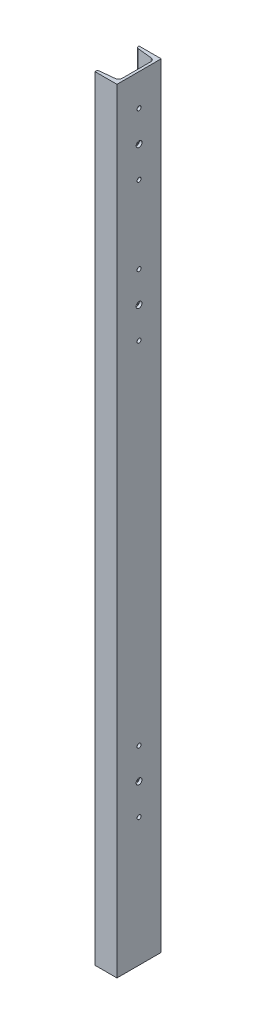
ISO-10303-21;
HEADER;
FILE_DESCRIPTION(('STEP AP214'),'2;1');
FILE_NAME('part.step','',(''),(''),'','','');
FILE_SCHEMA(('AUTOMOTIVE_DESIGN { 1 0 10303 214 1 1 1 1 }'));
ENDSEC;
DATA;
#1=APPLICATION_CONTEXT('core data for automotive mechanical design processes');
#2=APPLICATION_PROTOCOL_DEFINITION('international standard','automotive_design',2000,#1);
#3=PRODUCT_CONTEXT('',#1,'mechanical');
#4=PRODUCT('Part','Part','',(#3));
#5=PRODUCT_RELATED_PRODUCT_CATEGORY('part','',(#4));
#6=PRODUCT_DEFINITION_FORMATION('','',#4);
#7=PRODUCT_DEFINITION_CONTEXT('part definition',#1,'design');
#8=PRODUCT_DEFINITION('design','',#6,#7);
#9=PRODUCT_DEFINITION_SHAPE('','',#8);
#10=(LENGTH_UNIT() NAMED_UNIT(*) SI_UNIT(.MILLI.,.METRE.));
#11=(NAMED_UNIT(*) PLANE_ANGLE_UNIT() SI_UNIT($,.RADIAN.));
#12=(NAMED_UNIT(*) SI_UNIT($,.STERADIAN.) SOLID_ANGLE_UNIT());
#13=UNCERTAINTY_MEASURE_WITH_UNIT(LENGTH_MEASURE(1.E-05),#10,'distance_accuracy_value','');
#14=(GEOMETRIC_REPRESENTATION_CONTEXT(3) GLOBAL_UNCERTAINTY_ASSIGNED_CONTEXT((#13)) GLOBAL_UNIT_ASSIGNED_CONTEXT((#10,
#11,#12)) REPRESENTATION_CONTEXT('',''));
#15=CARTESIAN_POINT('',(0.,0.,0.));
#16=DIRECTION('',(0.,0.,1.));
#17=DIRECTION('',(1.,0.,0.));
#18=AXIS2_PLACEMENT_3D('',#15,#16,#17);
#19=CARTESIAN_POINT('',(-45.5,1750.,98.3701473289391));
#20=DIRECTION('',(0.,-1.,0.));
#21=DIRECTION('',(0.,0.,-1.));
#22=AXIS2_PLACEMENT_3D('',#19,#20,#21);
#23=CYLINDRICAL_SURFACE('',#22,4.50000000000001);
#24=CARTESIAN_POINT('',(-45.5,0.,98.3701473289391));
#25=DIRECTION('',(0.,1.,0.));
#26=DIRECTION('',(0.,0.,1.));
#27=AXIS2_PLACEMENT_3D('',#24,#25,#26);
#28=CIRCLE('',#27,4.50000000000001);
#29=CARTESIAN_POINT('',(-45.9703780847044,0.,93.8947987997819));
#30=VERTEX_POINT('',#29);
#31=CARTESIAN_POINT('',(-50.,0.,98.3701473289391));
#32=VERTEX_POINT('',#31);
#33=EDGE_CURVE('E214',#30,#32,#28,.T.);
#34=ORIENTED_EDGE('',*,*,#33,.T.);
#35=DIRECTION('',(0.,-1.,0.));
#36=VECTOR('',#35,1.);
#37=CARTESIAN_POINT('',(-50.,1750.,98.3701473289391));
#38=LINE('',#37,#36);
#39=CARTESIAN_POINT('',(-50.,1750.,98.3701473289391));
#40=VERTEX_POINT('',#39);
#41=EDGE_CURVE('E13',#40,#32,#38,.T.);
#42=ORIENTED_EDGE('',*,*,#41,.F.);
#43=CARTESIAN_POINT('',(-45.5,1750.,98.3701473289391));
#44=DIRECTION('',(0.,1.,0.));
#45=DIRECTION('',(0.,0.,1.));
#46=AXIS2_PLACEMENT_3D('',#43,#44,#45);
#47=CIRCLE('',#46,4.50000000000001);
#48=CARTESIAN_POINT('',(-45.9703780847044,1750.,93.8947987997819));
#49=VERTEX_POINT('',#48);
#50=EDGE_CURVE('E248',#49,#40,#47,.T.);
#51=ORIENTED_EDGE('',*,*,#50,.F.);
#52=DIRECTION('',(0.,-1.,0.));
#53=VECTOR('',#52,1.);
#54=CARTESIAN_POINT('',(-45.9703780847044,1750.,93.8947987997819));
#55=LINE('',#54,#53);
#56=EDGE_CURVE('E210',#49,#30,#55,.T.);
#57=ORIENTED_EDGE('',*,*,#56,.T.);
#58=EDGE_LOOP('',(#34,#42,#51,#57));
#59=FACE_BOUND('',#58,.T.);
#60=ADVANCED_FACE('F84',(#59),#23,.T.);
#61=CARTESIAN_POINT('',(-50.,1750.,100.));
#62=DIRECTION('',(1.,0.,0.));
#63=DIRECTION('',(0.,0.,-1.));
#64=AXIS2_PLACEMENT_3D('',#61,#62,#63);
#65=PLANE('',#64);
#66=DIRECTION('',(0.,0.,1.));
#67=VECTOR('',#66,1.);
#68=CARTESIAN_POINT('',(-50.,0.,100.));
#69=LINE('',#68,#67);
#70=CARTESIAN_POINT('',(-50.,0.,100.));
#71=VERTEX_POINT('',#70);
#72=EDGE_CURVE('E218',#32,#71,#69,.T.);
#73=ORIENTED_EDGE('',*,*,#72,.T.);
#74=DIRECTION('',(0.,-1.,0.));
#75=VECTOR('',#74,1.);
#76=CARTESIAN_POINT('',(-50.,1750.,100.));
#77=LINE('',#76,#75);
#78=CARTESIAN_POINT('',(-50.,1750.,100.));
#79=VERTEX_POINT('',#78);
#80=EDGE_CURVE('E94',#79,#71,#77,.T.);
#81=ORIENTED_EDGE('',*,*,#80,.F.);
#82=DIRECTION('',(0.,0.,1.));
#83=VECTOR('',#82,1.);
#84=CARTESIAN_POINT('',(-50.,1750.,100.));
#85=LINE('',#84,#83);
#86=EDGE_CURVE('E158',#40,#79,#85,.T.);
#87=ORIENTED_EDGE('',*,*,#86,.F.);
#88=ORIENTED_EDGE('',*,*,#41,.T.);
#89=EDGE_LOOP('',(#73,#81,#87,#88));
#90=FACE_BOUND('',#89,.T.);
#91=ADVANCED_FACE('F482',(#90),#65,.F.);
#92=CARTESIAN_POINT('',(-50.,1750.,100.));
#93=DIRECTION('',(0.,0.,-1.));
#94=DIRECTION('',(-1.,0.,0.));
#95=AXIS2_PLACEMENT_3D('',#92,#93,#94);
#96=PLANE('',#95);
#97=DIRECTION('',(1.,0.,0.));
#98=VECTOR('',#97,1.);
#99=CARTESIAN_POINT('',(-50.,0.,100.));
#100=LINE('',#99,#98);
#101=CARTESIAN_POINT('',(0.,0.,100.));
#102=VERTEX_POINT('',#101);
#103=EDGE_CURVE('E222',#71,#102,#100,.T.);
#104=ORIENTED_EDGE('',*,*,#103,.T.);
#105=DIRECTION('',(0.,-1.,0.));
#106=VECTOR('',#105,1.);
#107=CARTESIAN_POINT('',(0.,1750.,100.));
#108=LINE('',#107,#106);
#109=CARTESIAN_POINT('',(0.,1750.,100.));
#110=VERTEX_POINT('',#109);
#111=EDGE_CURVE('E275',#110,#102,#108,.T.);
#112=ORIENTED_EDGE('',*,*,#111,.F.);
#113=DIRECTION('',(1.,0.,0.));
#114=VECTOR('',#113,1.);
#115=CARTESIAN_POINT('',(-50.,1750.,100.));
#116=LINE('',#115,#114);
#117=EDGE_CURVE('E357',#79,#110,#116,.T.);
#118=ORIENTED_EDGE('',*,*,#117,.F.);
#119=ORIENTED_EDGE('',*,*,#80,.T.);
#120=EDGE_LOOP('',(#104,#112,#118,#119));
#121=FACE_BOUND('',#120,.T.);
#122=ADVANCED_FACE('F437',(#121),#96,.F.);
#123=CARTESIAN_POINT('',(0.,1750.,100.));
#124=DIRECTION('',(-1.,0.,0.));
#125=DIRECTION('',(0.,0.,1.));
#126=AXIS2_PLACEMENT_3D('',#123,#124,#125);
#127=PLANE('',#126);
#128=CARTESIAN_POINT('',(0.,1538.,50.));
#129=DIRECTION('',(1.,0.,0.));
#130=DIRECTION('',(0.,0.,-1.));
#131=AXIS2_PLACEMENT_3D('',#128,#129,#130);
#132=CIRCLE('',#131,4.59999999999994);
#133=CARTESIAN_POINT('',(0.,1538.,45.4000000000001));
#134=VERTEX_POINT('',#133);
#135=EDGE_CURVE('E326',#134,#134,#132,.T.);
#136=ORIENTED_EDGE('',*,*,#135,.F.);
#137=EDGE_LOOP('',(#136));
#138=FACE_BOUND('',#137,.T.);
#139=CARTESIAN_POINT('',(0.,1678.,50.));
#140=DIRECTION('',(1.,0.,0.));
#141=DIRECTION('',(0.,0.,-1.));
#142=AXIS2_PLACEMENT_3D('',#139,#140,#141);
#143=CIRCLE('',#142,4.59999999999994);
#144=CARTESIAN_POINT('',(0.,1678.,45.4000000000001));
#145=VERTEX_POINT('',#144);
#146=EDGE_CURVE('E311',#145,#145,#143,.T.);
#147=ORIENTED_EDGE('',*,*,#146,.F.);
#148=EDGE_LOOP('',(#147));
#149=FACE_BOUND('',#148,.T.);
#150=CARTESIAN_POINT('',(0.,1363.,50.));
#151=DIRECTION('',(1.,0.,0.));
#152=DIRECTION('',(0.,0.,-1.));
#153=AXIS2_PLACEMENT_3D('',#150,#151,#152);
#154=CIRCLE('',#153,4.59999999999994);
#155=CARTESIAN_POINT('',(0.,1363.,45.4000000000001));
#156=VERTEX_POINT('',#155);
#157=EDGE_CURVE('E307',#156,#156,#154,.T.);
#158=ORIENTED_EDGE('',*,*,#157,.F.);
#159=EDGE_LOOP('',(#158));
#160=FACE_BOUND('',#159,.T.);
#161=CARTESIAN_POINT('',(0.,1223.,50.));
#162=DIRECTION('',(1.,0.,0.));
#163=DIRECTION('',(0.,0.,-1.));
#164=AXIS2_PLACEMENT_3D('',#161,#162,#163);
#165=CIRCLE('',#164,4.59999999999994);
#166=CARTESIAN_POINT('',(0.,1223.,45.4000000000001));
#167=VERTEX_POINT('',#166);
#168=EDGE_CURVE('E303',#167,#167,#165,.T.);
#169=ORIENTED_EDGE('',*,*,#168,.F.);
#170=EDGE_LOOP('',(#169));
#171=FACE_BOUND('',#170,.T.);
#172=CARTESIAN_POINT('',(0.,430.,50.));
#173=DIRECTION('',(1.,0.,0.));
#174=DIRECTION('',(0.,0.,-1.));
#175=AXIS2_PLACEMENT_3D('',#172,#173,#174);
#176=CIRCLE('',#175,4.59999999999999);
#177=CARTESIAN_POINT('',(0.,430.,45.4));
#178=VERTEX_POINT('',#177);
#179=EDGE_CURVE('E298',#178,#178,#176,.T.);
#180=ORIENTED_EDGE('',*,*,#179,.F.);
#181=EDGE_LOOP('',(#180));
#182=FACE_BOUND('',#181,.T.);
#183=CARTESIAN_POINT('',(0.,290.,50.));
#184=DIRECTION('',(1.,0.,0.));
#185=DIRECTION('',(0.,0.,-1.));
#186=AXIS2_PLACEMENT_3D('',#183,#184,#185);
#187=CIRCLE('',#186,4.59999999999999);
#188=CARTESIAN_POINT('',(0.,290.,45.4));
#189=VERTEX_POINT('',#188);
#190=EDGE_CURVE('E297',#189,#189,#187,.T.);
#191=ORIENTED_EDGE('',*,*,#190,.F.);
#192=EDGE_LOOP('',(#191));
#193=FACE_BOUND('',#192,.T.);
#194=CARTESIAN_POINT('',(0.,1608.,50.));
#195=DIRECTION('',(1.,0.,0.));
#196=DIRECTION('',(0.,0.,-1.));
#197=AXIS2_PLACEMENT_3D('',#194,#195,#196);
#198=CIRCLE('',#197,6.59999999999994);
#199=CARTESIAN_POINT('',(0.,1608.,43.4000000000001));
#200=VERTEX_POINT('',#199);
#201=EDGE_CURVE('E292',#200,#200,#198,.T.);
#202=ORIENTED_EDGE('',*,*,#201,.F.);
#203=EDGE_LOOP('',(#202));
#204=FACE_BOUND('',#203,.T.);
#205=CARTESIAN_POINT('',(0.,1293.,50.));
#206=DIRECTION('',(1.,0.,0.));
#207=DIRECTION('',(0.,0.,-1.));
#208=AXIS2_PLACEMENT_3D('',#205,#206,#207);
#209=CIRCLE('',#208,6.59999999999994);
#210=CARTESIAN_POINT('',(0.,1293.,43.4000000000001));
#211=VERTEX_POINT('',#210);
#212=EDGE_CURVE('E287',#211,#211,#209,.T.);
#213=ORIENTED_EDGE('',*,*,#212,.F.);
#214=EDGE_LOOP('',(#213));
#215=FACE_BOUND('',#214,.T.);
#216=CARTESIAN_POINT('',(0.,360.,50.));
#217=DIRECTION('',(1.,0.,0.));
#218=DIRECTION('',(0.,0.,-1.));
#219=AXIS2_PLACEMENT_3D('',#216,#217,#218);
#220=CIRCLE('',#219,6.59999999999999);
#221=CARTESIAN_POINT('',(0.,360.,43.4));
#222=VERTEX_POINT('',#221);
#223=EDGE_CURVE('E286',#222,#222,#220,.T.);
#224=ORIENTED_EDGE('',*,*,#223,.F.);
#225=EDGE_LOOP('',(#224));
#226=FACE_BOUND('',#225,.T.);
#227=DIRECTION('',(0.,0.,-1.));
#228=VECTOR('',#227,1.);
#229=CARTESIAN_POINT('',(0.,0.,100.));
#230=LINE('',#229,#228);
#231=CARTESIAN_POINT('',(0.,0.,0.));
#232=VERTEX_POINT('',#231);
#233=EDGE_CURVE('E224',#102,#232,#230,.T.);
#234=ORIENTED_EDGE('',*,*,#233,.T.);
#235=DIRECTION('',(0.,-1.,0.));
#236=VECTOR('',#235,1.);
#237=CARTESIAN_POINT('',(0.,1750.,0.));
#238=LINE('',#237,#236);
#239=CARTESIAN_POINT('',(0.,1750.,0.));
#240=VERTEX_POINT('',#239);
#241=EDGE_CURVE('E271',#240,#232,#238,.T.);
#242=ORIENTED_EDGE('',*,*,#241,.F.);
#243=DIRECTION('',(0.,0.,-1.));
#244=VECTOR('',#243,1.);
#245=CARTESIAN_POINT('',(0.,1750.,100.));
#246=LINE('',#245,#244);
#247=EDGE_CURVE('E360',#110,#240,#246,.T.);
#248=ORIENTED_EDGE('',*,*,#247,.F.);
#249=ORIENTED_EDGE('',*,*,#111,.T.);
#250=EDGE_LOOP('',(#234,#242,#248,#249));
#251=FACE_BOUND('',#250,.T.);
#252=ADVANCED_FACE('F433',(#138,#149,#160,#171,#182,#193,#204,#215,#226,#251),#127,.F.);
#253=CARTESIAN_POINT('',(-50.,1750.,0.));
#254=DIRECTION('',(0.,0.,1.));
#255=DIRECTION('',(1.,0.,0.));
#256=AXIS2_PLACEMENT_3D('',#253,#254,#255);
#257=PLANE('',#256);
#258=DIRECTION('',(-1.,0.,0.));
#259=VECTOR('',#258,1.);
#260=CARTESIAN_POINT('',(-50.,0.,0.));
#261=LINE('',#260,#259);
#262=CARTESIAN_POINT('',(-50.,0.,0.));
#263=VERTEX_POINT('',#262);
#264=EDGE_CURVE('E227',#232,#263,#261,.T.);
#265=ORIENTED_EDGE('',*,*,#264,.T.);
#266=DIRECTION('',(0.,-1.,0.));
#267=VECTOR('',#266,1.);
#268=CARTESIAN_POINT('',(-50.,1750.,0.));
#269=LINE('',#268,#267);
#270=CARTESIAN_POINT('',(-50.,1750.,0.));
#271=VERTEX_POINT('',#270);
#272=EDGE_CURVE('E267',#271,#263,#269,.T.);
#273=ORIENTED_EDGE('',*,*,#272,.F.);
#274=DIRECTION('',(-1.,0.,0.));
#275=VECTOR('',#274,1.);
#276=CARTESIAN_POINT('',(-50.,1750.,0.));
#277=LINE('',#276,#275);
#278=EDGE_CURVE('E363',#240,#271,#277,.T.);
#279=ORIENTED_EDGE('',*,*,#278,.F.);
#280=ORIENTED_EDGE('',*,*,#241,.T.);
#281=EDGE_LOOP('',(#265,#273,#279,#280));
#282=FACE_BOUND('',#281,.T.);
#283=ADVANCED_FACE('F436',(#282),#257,.F.);
#284=CARTESIAN_POINT('',(-50.,1750.,0.));
#285=DIRECTION('',(1.,0.,0.));
#286=DIRECTION('',(0.,0.,-1.));
#287=AXIS2_PLACEMENT_3D('',#284,#285,#286);
#288=PLANE('',#287);
#289=DIRECTION('',(0.,0.,1.));
#290=VECTOR('',#289,1.);
#291=CARTESIAN_POINT('',(-50.,0.,0.));
#292=LINE('',#291,#290);
#293=CARTESIAN_POINT('',(-50.,0.,1.6298526710609));
#294=VERTEX_POINT('',#293);
#295=EDGE_CURVE('E230',#263,#294,#292,.T.);
#296=ORIENTED_EDGE('',*,*,#295,.T.);
#297=DIRECTION('',(0.,-1.,0.));
#298=VECTOR('',#297,1.);
#299=CARTESIAN_POINT('',(-50.,1750.,1.6298526710609));
#300=LINE('',#299,#298);
#301=CARTESIAN_POINT('',(-50.,1750.,1.6298526710609));
#302=VERTEX_POINT('',#301);
#303=EDGE_CURVE('E263',#302,#294,#300,.T.);
#304=ORIENTED_EDGE('',*,*,#303,.F.);
#305=DIRECTION('',(0.,0.,1.));
#306=VECTOR('',#305,1.);
#307=CARTESIAN_POINT('',(-50.,1750.,0.));
#308=LINE('',#307,#306);
#309=EDGE_CURVE('E366',#271,#302,#308,.T.);
#310=ORIENTED_EDGE('',*,*,#309,.F.);
#311=ORIENTED_EDGE('',*,*,#272,.T.);
#312=EDGE_LOOP('',(#296,#304,#310,#311));
#313=FACE_BOUND('',#312,.T.);
#314=ADVANCED_FACE('F471',(#313),#288,.F.);
#315=CARTESIAN_POINT('',(-45.5,1750.,1.6298526710609));
#316=DIRECTION('',(0.,-1.,0.));
#317=DIRECTION('',(0.,0.,-1.));
#318=AXIS2_PLACEMENT_3D('',#315,#316,#317);
#319=CYLINDRICAL_SURFACE('',#318,4.5);
#320=CARTESIAN_POINT('',(-45.5,0.,1.6298526710609));
#321=DIRECTION('',(0.,1.,0.));
#322=DIRECTION('',(0.,0.,-1.));
#323=AXIS2_PLACEMENT_3D('',#320,#321,#322);
#324=CIRCLE('',#323,4.5);
#325=CARTESIAN_POINT('',(-45.9703780847044,0.,6.10520120021813));
#326=VERTEX_POINT('',#325);
#327=EDGE_CURVE('E233',#294,#326,#324,.T.);
#328=ORIENTED_EDGE('',*,*,#327,.T.);
#329=DIRECTION('',(0.,-1.,0.));
#330=VECTOR('',#329,1.);
#331=CARTESIAN_POINT('',(-45.9703780847044,1750.,6.10520120021813));
#332=LINE('',#331,#330);
#333=CARTESIAN_POINT('',(-45.9703780847044,1750.,6.10520120021813));
#334=VERTEX_POINT('',#333);
#335=EDGE_CURVE('E259',#334,#326,#332,.T.);
#336=ORIENTED_EDGE('',*,*,#335,.F.);
#337=CARTESIAN_POINT('',(-45.5,1750.,1.6298526710609));
#338=DIRECTION('',(0.,1.,0.));
#339=DIRECTION('',(0.,0.,-1.));
#340=AXIS2_PLACEMENT_3D('',#337,#338,#339);
#341=CIRCLE('',#340,4.5);
#342=EDGE_CURVE('E369',#302,#334,#341,.T.);
#343=ORIENTED_EDGE('',*,*,#342,.F.);
#344=ORIENTED_EDGE('',*,*,#303,.T.);
#345=EDGE_LOOP('',(#328,#336,#343,#344));
#346=FACE_BOUND('',#345,.T.);
#347=ADVANCED_FACE('F475',(#346),#319,.T.);
#348=CARTESIAN_POINT('',(-13.0637722938588,1750.,9.56382483705384));
#349=DIRECTION('',(0.104528463267648,0.,-0.994521895368274));
#350=DIRECTION('',(-0.994521895368274,0.,-0.104528463267648));
#351=AXIS2_PLACEMENT_3D('',#348,#349,#350);
#352=PLANE('',#351);
#353=DIRECTION('',(0.994521895368274,0.,0.104528463267648));
#354=VECTOR('',#353,1.);
#355=CARTESIAN_POINT('',(-13.0637722938588,0.,9.56382483705384));
#356=LINE('',#355,#354);
#357=CARTESIAN_POINT('',(-13.0637722938588,0.,9.56382483705384));
#358=VERTEX_POINT('',#357);
#359=EDGE_CURVE('E236',#326,#358,#356,.T.);
#360=ORIENTED_EDGE('',*,*,#359,.T.);
#361=DIRECTION('',(0.,-1.,0.));
#362=VECTOR('',#361,1.);
#363=CARTESIAN_POINT('',(-13.0637722938588,1750.,9.56382483705384));
#364=LINE('',#363,#362);
#365=CARTESIAN_POINT('',(-13.0637722938588,1750.,9.56382483705384));
#366=VERTEX_POINT('',#365);
#367=EDGE_CURVE('E255',#366,#358,#364,.T.);
#368=ORIENTED_EDGE('',*,*,#367,.F.);
#369=DIRECTION('',(0.994521895368274,0.,0.104528463267648));
#370=VECTOR('',#369,1.);
#371=CARTESIAN_POINT('',(-13.0637722938588,1750.,9.56382483705384));
#372=LINE('',#371,#370);
#373=EDGE_CURVE('E372',#334,#366,#372,.T.);
#374=ORIENTED_EDGE('',*,*,#373,.F.);
#375=ORIENTED_EDGE('',*,*,#335,.T.);
#376=EDGE_LOOP('',(#360,#368,#374,#375));
#377=FACE_BOUND('',#376,.T.);
#378=ADVANCED_FACE('F490',(#377),#352,.F.);
#379=CARTESIAN_POINT('',(-13.9,1750.,17.52));
#380=DIRECTION('',(0.,-1.,0.));
#381=DIRECTION('',(0.,0.,-1.));
#382=AXIS2_PLACEMENT_3D('',#379,#380,#381);
#383=CYLINDRICAL_SURFACE('',#382,8.);
#384=CARTESIAN_POINT('',(-13.9,0.,17.52));
#385=DIRECTION('',(0.,-1.,0.));
#386=DIRECTION('',(0.,0.,1.));
#387=AXIS2_PLACEMENT_3D('',#384,#385,#386);
#388=CIRCLE('',#387,8.);
#389=CARTESIAN_POINT('',(-5.90000000000001,0.,17.52));
#390=VERTEX_POINT('',#389);
#391=EDGE_CURVE('E239',#358,#390,#388,.T.);
#392=ORIENTED_EDGE('',*,*,#391,.T.);
#393=DIRECTION('',(0.,-1.,0.));
#394=VECTOR('',#393,1.);
#395=CARTESIAN_POINT('',(-5.90000000000001,1750.,17.52));
#396=LINE('',#395,#394);
#397=CARTESIAN_POINT('',(-5.90000000000001,1750.,17.52));
#398=VERTEX_POINT('',#397);
#399=EDGE_CURVE('E200',#398,#390,#396,.T.);
#400=ORIENTED_EDGE('',*,*,#399,.F.);
#401=CARTESIAN_POINT('',(-13.9,1750.,17.52));
#402=DIRECTION('',(0.,-1.,0.));
#403=DIRECTION('',(0.,0.,1.));
#404=AXIS2_PLACEMENT_3D('',#401,#402,#403);
#405=CIRCLE('',#404,8.);
#406=EDGE_CURVE('E189',#366,#398,#405,.T.);
#407=ORIENTED_EDGE('',*,*,#406,.F.);
#408=ORIENTED_EDGE('',*,*,#367,.T.);
#409=EDGE_LOOP('',(#392,#400,#407,#408));
#410=FACE_BOUND('',#409,.T.);
#411=ADVANCED_FACE('F488',(#410),#383,.F.);
#412=CARTESIAN_POINT('',(-5.9,1750.,82.48));
#413=DIRECTION('',(1.,0.,0.));
#414=DIRECTION('',(0.,0.,-1.));
#415=AXIS2_PLACEMENT_3D('',#412,#413,#414);
#416=PLANE('',#415);
#417=CARTESIAN_POINT('',(-5.9,1538.,50.));
#418=DIRECTION('',(1.,0.,0.));
#419=DIRECTION('',(0.,0.,-1.));
#420=AXIS2_PLACEMENT_3D('',#417,#418,#419);
#421=CIRCLE('',#420,4.59999999999994);
#422=CARTESIAN_POINT('',(-5.9,1538.,45.4000000000001));
#423=VERTEX_POINT('',#422);
#424=EDGE_CURVE('E87',#423,#423,#421,.T.);
#425=ORIENTED_EDGE('',*,*,#424,.T.);
#426=EDGE_LOOP('',(#425));
#427=FACE_BOUND('',#426,.T.);
#428=CARTESIAN_POINT('',(-5.9,1678.,50.));
#429=DIRECTION('',(1.,0.,0.));
#430=DIRECTION('',(0.,0.,-1.));
#431=AXIS2_PLACEMENT_3D('',#428,#429,#430);
#432=CIRCLE('',#431,4.59999999999994);
#433=CARTESIAN_POINT('',(-5.9,1678.,45.4000000000001));
#434=VERTEX_POINT('',#433);
#435=EDGE_CURVE('E308',#434,#434,#432,.T.);
#436=ORIENTED_EDGE('',*,*,#435,.T.);
#437=EDGE_LOOP('',(#436));
#438=FACE_BOUND('',#437,.T.);
#439=CARTESIAN_POINT('',(-5.9,1363.,50.));
#440=DIRECTION('',(1.,0.,0.));
#441=DIRECTION('',(0.,0.,-1.));
#442=AXIS2_PLACEMENT_3D('',#439,#440,#441);
#443=CIRCLE('',#442,4.59999999999994);
#444=CARTESIAN_POINT('',(-5.9,1363.,45.4000000000001));
#445=VERTEX_POINT('',#444);
#446=EDGE_CURVE('E304',#445,#445,#443,.T.);
#447=ORIENTED_EDGE('',*,*,#446,.T.);
#448=EDGE_LOOP('',(#447));
#449=FACE_BOUND('',#448,.T.);
#450=CARTESIAN_POINT('',(-5.9,1223.,50.));
#451=DIRECTION('',(1.,0.,0.));
#452=DIRECTION('',(0.,0.,-1.));
#453=AXIS2_PLACEMENT_3D('',#450,#451,#452);
#454=CIRCLE('',#453,4.59999999999994);
#455=CARTESIAN_POINT('',(-5.9,1223.,45.4000000000001));
#456=VERTEX_POINT('',#455);
#457=EDGE_CURVE('E299',#456,#456,#454,.T.);
#458=ORIENTED_EDGE('',*,*,#457,.T.);
#459=EDGE_LOOP('',(#458));
#460=FACE_BOUND('',#459,.T.);
#461=CARTESIAN_POINT('',(-5.9,430.,50.));
#462=DIRECTION('',(1.,0.,0.));
#463=DIRECTION('',(0.,0.,-1.));
#464=AXIS2_PLACEMENT_3D('',#461,#462,#463);
#465=CIRCLE('',#464,4.59999999999999);
#466=CARTESIAN_POINT('',(-5.9,430.,45.4));
#467=VERTEX_POINT('',#466);
#468=EDGE_CURVE('E293',#467,#467,#465,.T.);
#469=ORIENTED_EDGE('',*,*,#468,.T.);
#470=EDGE_LOOP('',(#469));
#471=FACE_BOUND('',#470,.T.);
#472=CARTESIAN_POINT('',(-5.9,290.,50.));
#473=DIRECTION('',(1.,0.,0.));
#474=DIRECTION('',(0.,0.,-1.));
#475=AXIS2_PLACEMENT_3D('',#472,#473,#474);
#476=CIRCLE('',#475,4.59999999999999);
#477=CARTESIAN_POINT('',(-5.9,290.,45.4));
#478=VERTEX_POINT('',#477);
#479=EDGE_CURVE('E338',#478,#478,#476,.T.);
#480=ORIENTED_EDGE('',*,*,#479,.T.);
#481=EDGE_LOOP('',(#480));
#482=FACE_BOUND('',#481,.T.);
#483=CARTESIAN_POINT('',(-5.9,1608.,50.));
#484=DIRECTION('',(1.,0.,0.));
#485=DIRECTION('',(0.,0.,-1.));
#486=AXIS2_PLACEMENT_3D('',#483,#484,#485);
#487=CIRCLE('',#486,6.59999999999994);
#488=CARTESIAN_POINT('',(-5.9,1608.,43.4000000000001));
#489=VERTEX_POINT('',#488);
#490=EDGE_CURVE('E288',#489,#489,#487,.T.);
#491=ORIENTED_EDGE('',*,*,#490,.T.);
#492=EDGE_LOOP('',(#491));
#493=FACE_BOUND('',#492,.T.);
#494=CARTESIAN_POINT('',(-5.9,1293.,50.));
#495=DIRECTION('',(1.,0.,0.));
#496=DIRECTION('',(0.,0.,-1.));
#497=AXIS2_PLACEMENT_3D('',#494,#495,#496);
#498=CIRCLE('',#497,6.59999999999994);
#499=CARTESIAN_POINT('',(-5.9,1293.,43.4000000000001));
#500=VERTEX_POINT('',#499);
#501=EDGE_CURVE('E282',#500,#500,#498,.T.);
#502=ORIENTED_EDGE('',*,*,#501,.T.);
#503=EDGE_LOOP('',(#502));
#504=FACE_BOUND('',#503,.T.);
#505=CARTESIAN_POINT('',(-5.9,360.,50.));
#506=DIRECTION('',(1.,0.,0.));
#507=DIRECTION('',(0.,0.,-1.));
#508=AXIS2_PLACEMENT_3D('',#505,#506,#507);
#509=CIRCLE('',#508,6.59999999999999);
#510=CARTESIAN_POINT('',(-5.9,360.,43.4));
#511=VERTEX_POINT('',#510);
#512=EDGE_CURVE('E219',#511,#511,#509,.T.);
#513=ORIENTED_EDGE('',*,*,#512,.T.);
#514=EDGE_LOOP('',(#513));
#515=FACE_BOUND('',#514,.T.);
#516=DIRECTION('',(0.,0.,1.));
#517=VECTOR('',#516,1.);
#518=CARTESIAN_POINT('',(-5.9,0.,82.48));
#519=LINE('',#518,#517);
#520=CARTESIAN_POINT('',(-5.9,0.,82.48));
#521=VERTEX_POINT('',#520);
#522=EDGE_CURVE('E198',#390,#521,#519,.T.);
#523=ORIENTED_EDGE('',*,*,#522,.T.);
#524=DIRECTION('',(0.,-1.,0.));
#525=VECTOR('',#524,1.);
#526=CARTESIAN_POINT('',(-5.9,1750.,82.48));
#527=LINE('',#526,#525);
#528=CARTESIAN_POINT('',(-5.9,1750.,82.48));
#529=VERTEX_POINT('',#528);
#530=EDGE_CURVE('E195',#529,#521,#527,.T.);
#531=ORIENTED_EDGE('',*,*,#530,.F.);
#532=DIRECTION('',(0.,0.,1.));
#533=VECTOR('',#532,1.);
#534=CARTESIAN_POINT('',(-5.9,1750.,82.48));
#535=LINE('',#534,#533);
#536=EDGE_CURVE('E183',#398,#529,#535,.T.);
#537=ORIENTED_EDGE('',*,*,#536,.F.);
#538=ORIENTED_EDGE('',*,*,#399,.T.);
#539=EDGE_LOOP('',(#523,#531,#537,#538));
#540=FACE_BOUND('',#539,.T.);
#541=ADVANCED_FACE('F196',(#427,#438,#449,#460,#471,#482,#493,#504,#515,#540),#416,.F.);
#542=CARTESIAN_POINT('',(-13.9,1750.,82.48));
#543=DIRECTION('',(0.,-1.,0.));
#544=DIRECTION('',(0.,0.,-1.));
#545=AXIS2_PLACEMENT_3D('',#542,#543,#544);
#546=CYLINDRICAL_SURFACE('',#545,8.);
#547=CARTESIAN_POINT('',(-13.9,0.,82.48));
#548=DIRECTION('',(0.,-1.,0.));
#549=DIRECTION('',(0.,0.,-1.));
#550=AXIS2_PLACEMENT_3D('',#547,#548,#549);
#551=CIRCLE('',#550,8.);
#552=CARTESIAN_POINT('',(-13.0637722938588,0.,90.4361751629462));
#553=VERTEX_POINT('',#552);
#554=EDGE_CURVE('E144',#521,#553,#551,.T.);
#555=ORIENTED_EDGE('',*,*,#554,.T.);
#556=DIRECTION('',(0.,-1.,0.));
#557=VECTOR('',#556,1.);
#558=CARTESIAN_POINT('',(-13.0637722938588,1750.,90.4361751629462));
#559=LINE('',#558,#557);
#560=CARTESIAN_POINT('',(-13.0637722938588,1750.,90.4361751629462));
#561=VERTEX_POINT('',#560);
#562=EDGE_CURVE('E201',#561,#553,#559,.T.);
#563=ORIENTED_EDGE('',*,*,#562,.F.);
#564=CARTESIAN_POINT('',(-13.9,1750.,82.48));
#565=DIRECTION('',(0.,-1.,0.));
#566=DIRECTION('',(0.,0.,-1.));
#567=AXIS2_PLACEMENT_3D('',#564,#565,#566);
#568=CIRCLE('',#567,8.);
#569=EDGE_CURVE('E187',#529,#561,#568,.T.);
#570=ORIENTED_EDGE('',*,*,#569,.F.);
#571=ORIENTED_EDGE('',*,*,#530,.T.);
#572=EDGE_LOOP('',(#555,#563,#570,#571));
#573=FACE_BOUND('',#572,.T.);
#574=ADVANCED_FACE('F203',(#573),#546,.F.);
#575=CARTESIAN_POINT('',(-13.0637722938588,1750.,90.4361751629462));
#576=DIRECTION('',(0.104528463267647,0.,0.994521895368274));
#577=DIRECTION('',(0.994521895368274,0.,-0.104528463267647));
#578=AXIS2_PLACEMENT_3D('',#575,#576,#577);
#579=PLANE('',#578);
#580=DIRECTION('',(-0.994521895368274,0.,0.104528463267647));
#581=VECTOR('',#580,1.);
#582=CARTESIAN_POINT('',(-13.0637722938588,0.,90.4361751629462));
#583=LINE('',#582,#581);
#584=EDGE_CURVE('E150',#553,#30,#583,.T.);
#585=ORIENTED_EDGE('',*,*,#584,.T.);
#586=ORIENTED_EDGE('',*,*,#56,.F.);
#587=DIRECTION('',(-0.994521895368274,0.,0.104528463267647));
#588=VECTOR('',#587,1.);
#589=CARTESIAN_POINT('',(-13.0637722938588,1750.,90.4361751629462));
#590=LINE('',#589,#588);
#591=EDGE_CURVE('E103',#561,#49,#590,.T.);
#592=ORIENTED_EDGE('',*,*,#591,.F.);
#593=ORIENTED_EDGE('',*,*,#562,.T.);
#594=EDGE_LOOP('',(#585,#586,#592,#593));
#595=FACE_BOUND('',#594,.T.);
#596=ADVANCED_FACE('F485',(#595),#579,.F.);
#597=CARTESIAN_POINT('',(-45.5,1750.,98.3701473289391));
#598=DIRECTION('',(0.,1.,0.));
#599=DIRECTION('',(0.,0.,1.));
#600=AXIS2_PLACEMENT_3D('',#597,#598,#599);
#601=PLANE('',#600);
#602=ORIENTED_EDGE('',*,*,#50,.T.);
#603=ORIENTED_EDGE('',*,*,#86,.T.);
#604=ORIENTED_EDGE('',*,*,#117,.T.);
#605=ORIENTED_EDGE('',*,*,#247,.T.);
#606=ORIENTED_EDGE('',*,*,#278,.T.);
#607=ORIENTED_EDGE('',*,*,#309,.T.);
#608=ORIENTED_EDGE('',*,*,#342,.T.);
#609=ORIENTED_EDGE('',*,*,#373,.T.);
#610=ORIENTED_EDGE('',*,*,#406,.T.);
#611=ORIENTED_EDGE('',*,*,#536,.T.);
#612=ORIENTED_EDGE('',*,*,#569,.T.);
#613=ORIENTED_EDGE('',*,*,#591,.T.);
#614=EDGE_LOOP('',(#602,#603,#604,#605,#606,#607,#608,#609,#610,#611,#612,#613));
#615=FACE_BOUND('',#614,.T.);
#616=ADVANCED_FACE('F185',(#615),#601,.T.);
#617=CARTESIAN_POINT('',(-45.5,0.,98.3701473289391));
#618=DIRECTION('',(0.,1.,0.));
#619=DIRECTION('',(0.,0.,1.));
#620=AXIS2_PLACEMENT_3D('',#617,#618,#619);
#621=PLANE('',#620);
#622=ORIENTED_EDGE('',*,*,#33,.F.);
#623=ORIENTED_EDGE('',*,*,#584,.F.);
#624=ORIENTED_EDGE('',*,*,#554,.F.);
#625=ORIENTED_EDGE('',*,*,#522,.F.);
#626=ORIENTED_EDGE('',*,*,#391,.F.);
#627=ORIENTED_EDGE('',*,*,#359,.F.);
#628=ORIENTED_EDGE('',*,*,#327,.F.);
#629=ORIENTED_EDGE('',*,*,#295,.F.);
#630=ORIENTED_EDGE('',*,*,#264,.F.);
#631=ORIENTED_EDGE('',*,*,#233,.F.);
#632=ORIENTED_EDGE('',*,*,#103,.F.);
#633=ORIENTED_EDGE('',*,*,#72,.F.);
#634=EDGE_LOOP('',(#622,#623,#624,#625,#626,#627,#628,#629,#630,#631,#632,#633));
#635=FACE_BOUND('',#634,.T.);
#636=ADVANCED_FACE('F466',(#635),#621,.F.);
#637=CARTESIAN_POINT('',(0.,360.,50.));
#638=DIRECTION('',(1.,0.,0.));
#639=DIRECTION('',(0.,0.,-1.));
#640=AXIS2_PLACEMENT_3D('',#637,#638,#639);
#641=CYLINDRICAL_SURFACE('',#640,6.59999999999999);
#642=ORIENTED_EDGE('',*,*,#223,.T.);
#643=EDGE_LOOP('',(#642));
#644=FACE_BOUND('',#643,.T.);
#645=ORIENTED_EDGE('',*,*,#512,.F.);
#646=EDGE_LOOP('',(#645));
#647=FACE_BOUND('',#646,.T.);
#648=ADVANCED_FACE('F564',(#644,#647),#641,.F.);
#649=CARTESIAN_POINT('',(0.,1293.,50.));
#650=DIRECTION('',(1.,0.,0.));
#651=DIRECTION('',(0.,0.,-1.));
#652=AXIS2_PLACEMENT_3D('',#649,#650,#651);
#653=CYLINDRICAL_SURFACE('',#652,6.59999999999994);
#654=ORIENTED_EDGE('',*,*,#212,.T.);
#655=EDGE_LOOP('',(#654));
#656=FACE_BOUND('',#655,.T.);
#657=ORIENTED_EDGE('',*,*,#501,.F.);
#658=EDGE_LOOP('',(#657));
#659=FACE_BOUND('',#658,.T.);
#660=ADVANCED_FACE('F572',(#656,#659),#653,.F.);
#661=CARTESIAN_POINT('',(0.,1608.,50.));
#662=DIRECTION('',(1.,0.,0.));
#663=DIRECTION('',(0.,0.,-1.));
#664=AXIS2_PLACEMENT_3D('',#661,#662,#663);
#665=CYLINDRICAL_SURFACE('',#664,6.59999999999994);
#666=ORIENTED_EDGE('',*,*,#201,.T.);
#667=EDGE_LOOP('',(#666));
#668=FACE_BOUND('',#667,.T.);
#669=ORIENTED_EDGE('',*,*,#490,.F.);
#670=EDGE_LOOP('',(#669));
#671=FACE_BOUND('',#670,.T.);
#672=ADVANCED_FACE('F581',(#668,#671),#665,.F.);
#673=CARTESIAN_POINT('',(0.,290.,50.));
#674=DIRECTION('',(1.,0.,0.));
#675=DIRECTION('',(0.,0.,-1.));
#676=AXIS2_PLACEMENT_3D('',#673,#674,#675);
#677=CYLINDRICAL_SURFACE('',#676,4.59999999999999);
#678=ORIENTED_EDGE('',*,*,#190,.T.);
#679=EDGE_LOOP('',(#678));
#680=FACE_BOUND('',#679,.T.);
#681=ORIENTED_EDGE('',*,*,#479,.F.);
#682=EDGE_LOOP('',(#681));
#683=FACE_BOUND('',#682,.T.);
#684=ADVANCED_FACE('F590',(#680,#683),#677,.F.);
#685=CARTESIAN_POINT('',(0.,430.,50.));
#686=DIRECTION('',(1.,0.,0.));
#687=DIRECTION('',(0.,0.,-1.));
#688=AXIS2_PLACEMENT_3D('',#685,#686,#687);
#689=CYLINDRICAL_SURFACE('',#688,4.59999999999999);
#690=ORIENTED_EDGE('',*,*,#179,.T.);
#691=EDGE_LOOP('',(#690));
#692=FACE_BOUND('',#691,.T.);
#693=ORIENTED_EDGE('',*,*,#468,.F.);
#694=EDGE_LOOP('',(#693));
#695=FACE_BOUND('',#694,.T.);
#696=ADVANCED_FACE('F598',(#692,#695),#689,.F.);
#697=CARTESIAN_POINT('',(0.,1223.,50.));
#698=DIRECTION('',(1.,0.,0.));
#699=DIRECTION('',(0.,0.,-1.));
#700=AXIS2_PLACEMENT_3D('',#697,#698,#699);
#701=CYLINDRICAL_SURFACE('',#700,4.59999999999994);
#702=ORIENTED_EDGE('',*,*,#168,.T.);
#703=EDGE_LOOP('',(#702));
#704=FACE_BOUND('',#703,.T.);
#705=ORIENTED_EDGE('',*,*,#457,.F.);
#706=EDGE_LOOP('',(#705));
#707=FACE_BOUND('',#706,.T.);
#708=ADVANCED_FACE('F607',(#704,#707),#701,.F.);
#709=CARTESIAN_POINT('',(0.,1363.,50.));
#710=DIRECTION('',(1.,0.,0.));
#711=DIRECTION('',(0.,0.,-1.));
#712=AXIS2_PLACEMENT_3D('',#709,#710,#711);
#713=CYLINDRICAL_SURFACE('',#712,4.59999999999994);
#714=ORIENTED_EDGE('',*,*,#157,.T.);
#715=EDGE_LOOP('',(#714));
#716=FACE_BOUND('',#715,.T.);
#717=ORIENTED_EDGE('',*,*,#446,.F.);
#718=EDGE_LOOP('',(#717));
#719=FACE_BOUND('',#718,.T.);
#720=ADVANCED_FACE('F616',(#716,#719),#713,.F.);
#721=CARTESIAN_POINT('',(0.,1678.,50.));
#722=DIRECTION('',(1.,0.,0.));
#723=DIRECTION('',(0.,0.,-1.));
#724=AXIS2_PLACEMENT_3D('',#721,#722,#723);
#725=CYLINDRICAL_SURFACE('',#724,4.59999999999994);
#726=ORIENTED_EDGE('',*,*,#146,.T.);
#727=EDGE_LOOP('',(#726));
#728=FACE_BOUND('',#727,.T.);
#729=ORIENTED_EDGE('',*,*,#435,.F.);
#730=EDGE_LOOP('',(#729));
#731=FACE_BOUND('',#730,.T.);
#732=ADVANCED_FACE('F625',(#728,#731),#725,.F.);
#733=CARTESIAN_POINT('',(0.,1538.,50.));
#734=DIRECTION('',(1.,0.,0.));
#735=DIRECTION('',(0.,0.,-1.));
#736=AXIS2_PLACEMENT_3D('',#733,#734,#735);
#737=CYLINDRICAL_SURFACE('',#736,4.59999999999994);
#738=ORIENTED_EDGE('',*,*,#135,.T.);
#739=EDGE_LOOP('',(#738));
#740=FACE_BOUND('',#739,.T.);
#741=ORIENTED_EDGE('',*,*,#424,.F.);
#742=EDGE_LOOP('',(#741));
#743=FACE_BOUND('',#742,.T.);
#744=ADVANCED_FACE('F430',(#740,#743),#737,.F.);
#745=CLOSED_SHELL('',(#60,#91,#122,#252,#283,#314,#347,#378,#411,#541,#574,#596,#616,#636,#648,
#660,#672,#684,#696,#708,#720,#732,#744));
#746=MANIFOLD_SOLID_BREP('B2',#745);
#747=ADVANCED_BREP_SHAPE_REPRESENTATION('',(#18,#746),#14);
#748=SHAPE_DEFINITION_REPRESENTATION(#9,#747);
ENDSEC;
END-ISO-10303-21;
